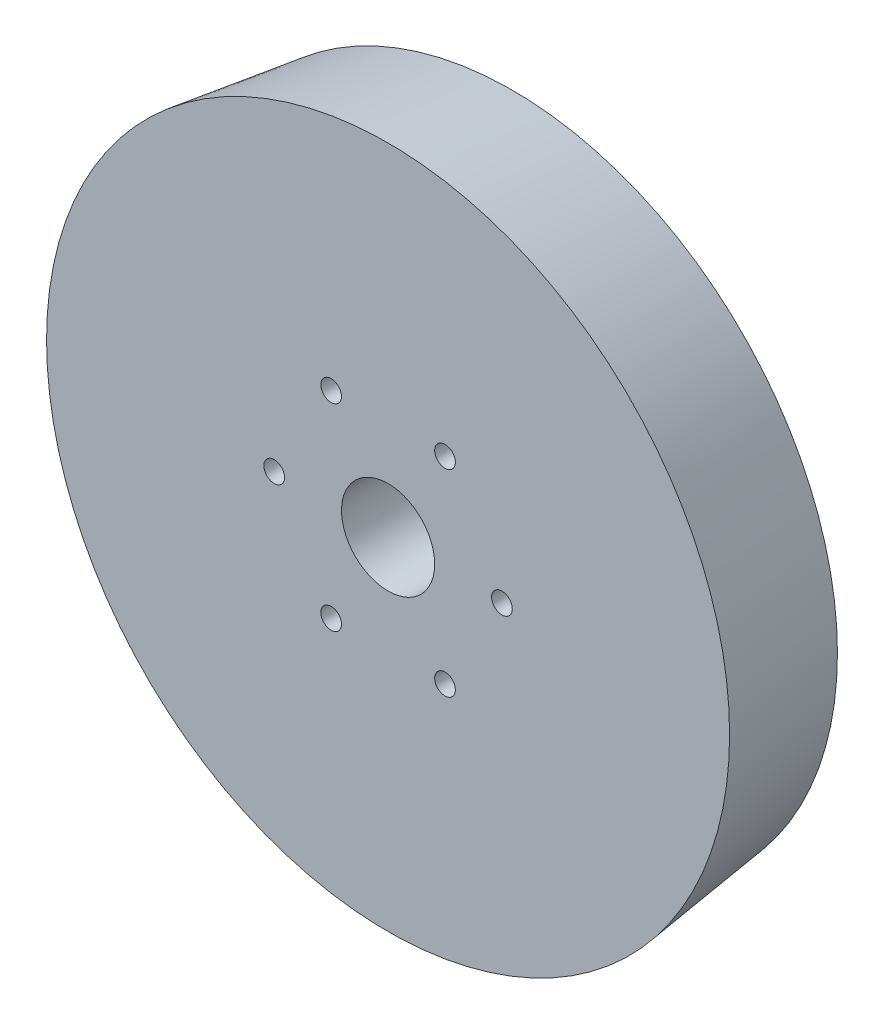
ISO-10303-21;
HEADER;
FILE_DESCRIPTION(('STEP AP214'),'2;1');
FILE_NAME('part.step','',(''),(''),'','','');
FILE_SCHEMA(('AUTOMOTIVE_DESIGN { 1 0 10303 214 1 1 1 1 }'));
ENDSEC;
DATA;
#1=APPLICATION_CONTEXT('core data for automotive mechanical design processes');
#2=APPLICATION_PROTOCOL_DEFINITION('international standard','automotive_design',2000,#1);
#3=PRODUCT_CONTEXT('',#1,'mechanical');
#4=PRODUCT('Part','Part','',(#3));
#5=PRODUCT_RELATED_PRODUCT_CATEGORY('part','',(#4));
#6=PRODUCT_DEFINITION_FORMATION('','',#4);
#7=PRODUCT_DEFINITION_CONTEXT('part definition',#1,'design');
#8=PRODUCT_DEFINITION('design','',#6,#7);
#9=PRODUCT_DEFINITION_SHAPE('','',#8);
#10=(LENGTH_UNIT() NAMED_UNIT(*) SI_UNIT(.MILLI.,.METRE.));
#11=(NAMED_UNIT(*) PLANE_ANGLE_UNIT() SI_UNIT($,.RADIAN.));
#12=(NAMED_UNIT(*) SI_UNIT($,.STERADIAN.) SOLID_ANGLE_UNIT());
#13=UNCERTAINTY_MEASURE_WITH_UNIT(LENGTH_MEASURE(1.E-05),#10,'distance_accuracy_value','');
#14=(GEOMETRIC_REPRESENTATION_CONTEXT(3) GLOBAL_UNCERTAINTY_ASSIGNED_CONTEXT((#13)) GLOBAL_UNIT_ASSIGNED_CONTEXT((#10,
#11,#12)) REPRESENTATION_CONTEXT('',''));
#15=CARTESIAN_POINT('',(0.,0.,0.));
#16=DIRECTION('',(0.,0.,1.));
#17=DIRECTION('',(1.,0.,0.));
#18=AXIS2_PLACEMENT_3D('',#15,#16,#17);
#19=CARTESIAN_POINT('',(0.,0.,0.));
#20=DIRECTION('',(0.,0.,1.));
#21=DIRECTION('',(1.,0.,0.));
#22=AXIS2_PLACEMENT_3D('',#19,#20,#21);
#23=CONICAL_SURFACE('',#22,104.775,0.130899693899575);
#24=CARTESIAN_POINT('',(0.,0.,-38.1));
#25=DIRECTION('',(0.,0.,1.));
#26=DIRECTION('',(1.,0.,0.));
#27=AXIS2_PLACEMENT_3D('',#24,#25,#26);
#28=CIRCLE('',#27,99.7590398419202);
#29=CARTESIAN_POINT('',(99.7590398419202,0.,-38.1));
#30=VERTEX_POINT('',#29);
#31=EDGE_CURVE('E10',#30,#30,#28,.T.);
#32=ORIENTED_EDGE('',*,*,#31,.T.);
#33=EDGE_LOOP('',(#32));
#34=FACE_BOUND('',#33,.T.);
#35=CARTESIAN_POINT('',(0.,0.,0.));
#36=DIRECTION('',(0.,0.,1.));
#37=DIRECTION('',(1.,0.,0.));
#38=AXIS2_PLACEMENT_3D('',#35,#36,#37);
#39=CIRCLE('',#38,104.775);
#40=CARTESIAN_POINT('',(104.775,0.,0.));
#41=VERTEX_POINT('',#40);
#42=EDGE_CURVE('E39',#41,#41,#39,.T.);
#43=ORIENTED_EDGE('',*,*,#42,.F.);
#44=EDGE_LOOP('',(#43));
#45=FACE_BOUND('',#44,.T.);
#46=ADVANCED_FACE('F32',(#34,#45),#23,.T.);
#47=CARTESIAN_POINT('',(0.,0.,-38.1));
#48=DIRECTION('',(0.,0.,1.));
#49=DIRECTION('',(1.,0.,0.));
#50=AXIS2_PLACEMENT_3D('',#47,#48,#49);
#51=PLANE('',#50);
#52=CARTESIAN_POINT('',(17.4625000000004,30.2459372271713,-38.1));
#53=DIRECTION('',(0.,0.,1.));
#54=DIRECTION('',(1.,0.,0.));
#55=AXIS2_PLACEMENT_3D('',#52,#53,#54);
#56=CIRCLE('',#55,3.175);
#57=CARTESIAN_POINT('',(20.6375000000004,30.2459372271713,-38.1));
#58=VERTEX_POINT('',#57);
#59=EDGE_CURVE('E85',#58,#58,#56,.T.);
#60=ORIENTED_EDGE('',*,*,#59,.T.);
#61=EDGE_LOOP('',(#60));
#62=FACE_BOUND('',#61,.T.);
#63=CARTESIAN_POINT('',(-17.4624999999997,30.2459372271717,-38.1));
#64=DIRECTION('',(0.,0.,1.));
#65=DIRECTION('',(1.,0.,0.));
#66=AXIS2_PLACEMENT_3D('',#63,#64,#65);
#67=CIRCLE('',#66,3.175);
#68=CARTESIAN_POINT('',(-14.2874999999997,30.2459372271717,-38.1));
#69=VERTEX_POINT('',#68);
#70=EDGE_CURVE('E79',#69,#69,#67,.T.);
#71=ORIENTED_EDGE('',*,*,#70,.T.);
#72=EDGE_LOOP('',(#71));
#73=FACE_BOUND('',#72,.T.);
#74=CARTESIAN_POINT('',(-34.925,2.43879971518193E-13,-38.1));
#75=DIRECTION('',(0.,0.,1.));
#76=DIRECTION('',(1.,0.,0.));
#77=AXIS2_PLACEMENT_3D('',#74,#75,#76);
#78=CIRCLE('',#77,3.175);
#79=CARTESIAN_POINT('',(-31.75,2.43879971518193E-13,-38.1));
#80=VERTEX_POINT('',#79);
#81=EDGE_CURVE('E73',#80,#80,#78,.T.);
#82=ORIENTED_EDGE('',*,*,#81,.T.);
#83=EDGE_LOOP('',(#82));
#84=FACE_BOUND('',#83,.T.);
#85=CARTESIAN_POINT('',(-17.4625000000001,-30.2459372271714,-38.1));
#86=DIRECTION('',(0.,0.,1.));
#87=DIRECTION('',(1.,0.,0.));
#88=AXIS2_PLACEMENT_3D('',#85,#86,#87);
#89=CIRCLE('',#88,3.175);
#90=CARTESIAN_POINT('',(-14.2875000000001,-30.2459372271714,-38.1));
#91=VERTEX_POINT('',#90);
#92=EDGE_CURVE('E67',#91,#91,#89,.T.);
#93=ORIENTED_EDGE('',*,*,#92,.T.);
#94=EDGE_LOOP('',(#93));
#95=FACE_BOUND('',#94,.T.);
#96=CARTESIAN_POINT('',(17.4624999999999,-30.2459372271716,-38.1));
#97=DIRECTION('',(0.,0.,1.));
#98=DIRECTION('',(1.,0.,0.));
#99=AXIS2_PLACEMENT_3D('',#96,#97,#98);
#100=CIRCLE('',#99,3.17499999999999);
#101=CARTESIAN_POINT('',(20.6374999999999,-30.2459372271716,-38.1));
#102=VERTEX_POINT('',#101);
#103=EDGE_CURVE('E61',#102,#102,#100,.T.);
#104=ORIENTED_EDGE('',*,*,#103,.T.);
#105=EDGE_LOOP('',(#104));
#106=FACE_BOUND('',#105,.T.);
#107=CARTESIAN_POINT('',(34.925,0.,-38.1));
#108=DIRECTION('',(0.,0.,1.));
#109=DIRECTION('',(1.,0.,0.));
#110=AXIS2_PLACEMENT_3D('',#107,#108,#109);
#111=CIRCLE('',#110,3.175);
#112=CARTESIAN_POINT('',(38.1,0.,-38.1));
#113=VERTEX_POINT('',#112);
#114=EDGE_CURVE('E55',#113,#113,#111,.T.);
#115=ORIENTED_EDGE('',*,*,#114,.T.);
#116=EDGE_LOOP('',(#115));
#117=FACE_BOUND('',#116,.T.);
#118=CARTESIAN_POINT('',(0.,0.,-38.1));
#119=DIRECTION('',(0.,0.,1.));
#120=DIRECTION('',(1.,0.,0.));
#121=AXIS2_PLACEMENT_3D('',#118,#119,#120);
#122=CIRCLE('',#121,14.2875);
#123=CARTESIAN_POINT('',(14.2875,0.,-38.1));
#124=VERTEX_POINT('',#123);
#125=EDGE_CURVE('E46',#124,#124,#122,.T.);
#126=ORIENTED_EDGE('',*,*,#125,.T.);
#127=EDGE_LOOP('',(#126));
#128=FACE_BOUND('',#127,.T.);
#129=ORIENTED_EDGE('',*,*,#31,.F.);
#130=EDGE_LOOP('',(#129));
#131=FACE_BOUND('',#130,.T.);
#132=ADVANCED_FACE('F98',(#62,#73,#84,#95,#106,#117,#128,#131),#51,.F.);
#133=CARTESIAN_POINT('',(0.,0.,0.));
#134=DIRECTION('',(0.,0.,1.));
#135=DIRECTION('',(1.,0.,0.));
#136=AXIS2_PLACEMENT_3D('',#133,#134,#135);
#137=PLANE('',#136);
#138=CARTESIAN_POINT('',(17.4625000000004,30.2459372271713,0.));
#139=DIRECTION('',(0.,0.,1.));
#140=DIRECTION('',(1.,0.,0.));
#141=AXIS2_PLACEMENT_3D('',#138,#139,#140);
#142=CIRCLE('',#141,3.175);
#143=CARTESIAN_POINT('',(20.6375000000004,30.2459372271713,0.));
#144=VERTEX_POINT('',#143);
#145=EDGE_CURVE('E88',#144,#144,#142,.T.);
#146=ORIENTED_EDGE('',*,*,#145,.F.);
#147=EDGE_LOOP('',(#146));
#148=FACE_BOUND('',#147,.T.);
#149=CARTESIAN_POINT('',(-17.4624999999997,30.2459372271717,0.));
#150=DIRECTION('',(0.,0.,1.));
#151=DIRECTION('',(1.,0.,0.));
#152=AXIS2_PLACEMENT_3D('',#149,#150,#151);
#153=CIRCLE('',#152,3.175);
#154=CARTESIAN_POINT('',(-14.2874999999997,30.2459372271717,0.));
#155=VERTEX_POINT('',#154);
#156=EDGE_CURVE('E82',#155,#155,#153,.T.);
#157=ORIENTED_EDGE('',*,*,#156,.F.);
#158=EDGE_LOOP('',(#157));
#159=FACE_BOUND('',#158,.T.);
#160=CARTESIAN_POINT('',(-34.925,2.43879971518193E-13,0.));
#161=DIRECTION('',(0.,0.,1.));
#162=DIRECTION('',(1.,0.,0.));
#163=AXIS2_PLACEMENT_3D('',#160,#161,#162);
#164=CIRCLE('',#163,3.175);
#165=CARTESIAN_POINT('',(-31.75,2.43879971518193E-13,0.));
#166=VERTEX_POINT('',#165);
#167=EDGE_CURVE('E76',#166,#166,#164,.T.);
#168=ORIENTED_EDGE('',*,*,#167,.F.);
#169=EDGE_LOOP('',(#168));
#170=FACE_BOUND('',#169,.T.);
#171=CARTESIAN_POINT('',(-17.4625000000001,-30.2459372271714,0.));
#172=DIRECTION('',(0.,0.,1.));
#173=DIRECTION('',(1.,0.,0.));
#174=AXIS2_PLACEMENT_3D('',#171,#172,#173);
#175=CIRCLE('',#174,3.175);
#176=CARTESIAN_POINT('',(-14.2875000000001,-30.2459372271714,0.));
#177=VERTEX_POINT('',#176);
#178=EDGE_CURVE('E70',#177,#177,#175,.T.);
#179=ORIENTED_EDGE('',*,*,#178,.F.);
#180=EDGE_LOOP('',(#179));
#181=FACE_BOUND('',#180,.T.);
#182=CARTESIAN_POINT('',(17.4624999999999,-30.2459372271716,0.));
#183=DIRECTION('',(0.,0.,1.));
#184=DIRECTION('',(1.,0.,0.));
#185=AXIS2_PLACEMENT_3D('',#182,#183,#184);
#186=CIRCLE('',#185,3.17499999999999);
#187=CARTESIAN_POINT('',(20.6374999999999,-30.2459372271716,0.));
#188=VERTEX_POINT('',#187);
#189=EDGE_CURVE('E64',#188,#188,#186,.T.);
#190=ORIENTED_EDGE('',*,*,#189,.F.);
#191=EDGE_LOOP('',(#190));
#192=FACE_BOUND('',#191,.T.);
#193=CARTESIAN_POINT('',(34.925,0.,0.));
#194=DIRECTION('',(0.,0.,1.));
#195=DIRECTION('',(1.,0.,0.));
#196=AXIS2_PLACEMENT_3D('',#193,#194,#195);
#197=CIRCLE('',#196,3.175);
#198=CARTESIAN_POINT('',(38.1,0.,0.));
#199=VERTEX_POINT('',#198);
#200=EDGE_CURVE('E57',#199,#199,#197,.T.);
#201=ORIENTED_EDGE('',*,*,#200,.F.);
#202=EDGE_LOOP('',(#201));
#203=FACE_BOUND('',#202,.T.);
#204=CARTESIAN_POINT('',(0.,0.,0.));
#205=DIRECTION('',(0.,0.,1.));
#206=DIRECTION('',(1.,0.,0.));
#207=AXIS2_PLACEMENT_3D('',#204,#205,#206);
#208=CIRCLE('',#207,14.2875);
#209=CARTESIAN_POINT('',(14.2875,0.,0.));
#210=VERTEX_POINT('',#209);
#211=EDGE_CURVE('E51',#210,#210,#208,.T.);
#212=ORIENTED_EDGE('',*,*,#211,.F.);
#213=EDGE_LOOP('',(#212));
#214=FACE_BOUND('',#213,.T.);
#215=ORIENTED_EDGE('',*,*,#42,.T.);
#216=EDGE_LOOP('',(#215));
#217=FACE_BOUND('',#216,.T.);
#218=ADVANCED_FACE('F108',(#148,#159,#170,#181,#192,#203,#214,#217),#137,.T.);
#219=CARTESIAN_POINT('',(0.,0.,-38.1));
#220=DIRECTION('',(0.,0.,1.));
#221=DIRECTION('',(1.,0.,0.));
#222=AXIS2_PLACEMENT_3D('',#219,#220,#221);
#223=CYLINDRICAL_SURFACE('',#222,14.2875);
#224=CARTESIAN_POINT('',(14.2875,0.,-38.1));
#225=CARTESIAN_POINT('',(14.2875,0.,-37.703125));
#226=CARTESIAN_POINT('',(14.2875,0.,-37.30625));
#227=CARTESIAN_POINT('',(14.2875,0.,-36.5125));
#228=CARTESIAN_POINT('',(14.2875,0.,-36.115625));
#229=CARTESIAN_POINT('',(14.2875,0.,-35.321875));
#230=CARTESIAN_POINT('',(14.2875,0.,-34.925));
#231=CARTESIAN_POINT('',(14.2875,0.,-34.13125));
#232=CARTESIAN_POINT('',(14.2875,0.,-33.734375));
#233=CARTESIAN_POINT('',(14.2875,0.,-32.940625));
#234=CARTESIAN_POINT('',(14.2875,0.,-32.54375));
#235=CARTESIAN_POINT('',(14.2875,0.,-31.75));
#236=CARTESIAN_POINT('',(14.2875,0.,-31.353125));
#237=CARTESIAN_POINT('',(14.2875,0.,-30.559375));
#238=CARTESIAN_POINT('',(14.2875,0.,-30.1625));
#239=CARTESIAN_POINT('',(14.2875,0.,-29.36875));
#240=CARTESIAN_POINT('',(14.2875,0.,-28.971875));
#241=CARTESIAN_POINT('',(14.2875,0.,-28.178125));
#242=CARTESIAN_POINT('',(14.2875,0.,-27.78125));
#243=CARTESIAN_POINT('',(14.2875,0.,-26.9875));
#244=CARTESIAN_POINT('',(14.2875,0.,-26.590625));
#245=CARTESIAN_POINT('',(14.2875,0.,-25.796875));
#246=CARTESIAN_POINT('',(14.2875,0.,-25.4));
#247=CARTESIAN_POINT('',(14.2875,0.,-24.60625));
#248=CARTESIAN_POINT('',(14.2875,0.,-24.209375));
#249=CARTESIAN_POINT('',(14.2875,0.,-23.415625));
#250=CARTESIAN_POINT('',(14.2875,0.,-23.01875));
#251=CARTESIAN_POINT('',(14.2875,0.,-22.225));
#252=CARTESIAN_POINT('',(14.2875,0.,-21.828125));
#253=CARTESIAN_POINT('',(14.2875,0.,-21.034375));
#254=CARTESIAN_POINT('',(14.2875,0.,-20.6375));
#255=CARTESIAN_POINT('',(14.2875,0.,-19.84375));
#256=CARTESIAN_POINT('',(14.2875,0.,-19.446875));
#257=CARTESIAN_POINT('',(14.2875,0.,-18.653125));
#258=CARTESIAN_POINT('',(14.2875,0.,-18.25625));
#259=CARTESIAN_POINT('',(14.2875,0.,-17.4625));
#260=CARTESIAN_POINT('',(14.2875,0.,-17.065625));
#261=CARTESIAN_POINT('',(14.2875,0.,-16.271875));
#262=CARTESIAN_POINT('',(14.2875,0.,-15.875));
#263=CARTESIAN_POINT('',(14.2875,0.,-15.08125));
#264=CARTESIAN_POINT('',(14.2875,0.,-14.684375));
#265=CARTESIAN_POINT('',(14.2875,0.,-13.890625));
#266=CARTESIAN_POINT('',(14.2875,0.,-13.49375));
#267=CARTESIAN_POINT('',(14.2875,0.,-12.7));
#268=CARTESIAN_POINT('',(14.2875,0.,-12.303125));
#269=CARTESIAN_POINT('',(14.2875,0.,-11.509375));
#270=CARTESIAN_POINT('',(14.2875,0.,-11.1125));
#271=CARTESIAN_POINT('',(14.2875,0.,-10.31875));
#272=CARTESIAN_POINT('',(14.2875,0.,-9.921875));
#273=CARTESIAN_POINT('',(14.2875,0.,-9.128125));
#274=CARTESIAN_POINT('',(14.2875,0.,-8.73125));
#275=CARTESIAN_POINT('',(14.2875,0.,-7.9375));
#276=CARTESIAN_POINT('',(14.2875,0.,-7.540625));
#277=CARTESIAN_POINT('',(14.2875,0.,-6.746875));
#278=CARTESIAN_POINT('',(14.2875,0.,-6.35));
#279=CARTESIAN_POINT('',(14.2875,0.,-5.55625));
#280=CARTESIAN_POINT('',(14.2875,0.,-5.159375));
#281=CARTESIAN_POINT('',(14.2875,0.,-4.365625));
#282=CARTESIAN_POINT('',(14.2875,0.,-3.96875));
#283=CARTESIAN_POINT('',(14.2875,0.,-3.175));
#284=CARTESIAN_POINT('',(14.2875,0.,-2.778125));
#285=CARTESIAN_POINT('',(14.2875,0.,-1.984375));
#286=CARTESIAN_POINT('',(14.2875,0.,-1.5875));
#287=CARTESIAN_POINT('',(14.2875,0.,-0.79375));
#288=CARTESIAN_POINT('',(14.2875,0.,-0.396875));
#289=CARTESIAN_POINT('',(14.2875,0.,0.));
#290=B_SPLINE_CURVE_WITH_KNOTS('',3,(#224,#225,#226,#227,#228,#229,#230,#231,#232,#233,#234,
#235,#236,#237,#238,#239,#240,#241,#242,#243,#244,#245,#246,#247,#248,#249,#250,#251,#252,#253,
#254,#255,#256,#257,#258,#259,#260,#261,#262,#263,#264,#265,#266,#267,#268,#269,#270,#271,#272,
#273,#274,#275,#276,#277,#278,#279,#280,#281,#282,#283,#284,#285,#286,#287,#288,#289),
.UNSPECIFIED.,.F.,.F.,(4,2,2,2,2,2,2,2,2,2,2,2,2,2,2,2,2,2,2,2,2,2,2,2,2,2,2,2,2,2,2,2,4),(0.,
1.190625,2.38125,3.571875,4.7625,5.953125,7.14375,8.334375,9.52500000000001,10.715625,11.90625,
13.096875,14.2875,15.478125,16.66875,17.859375,19.05,20.240625,21.43125,22.621875,23.8125,
25.003125,26.19375,27.384375,28.575,29.765625,30.95625,32.146875,33.3375,34.528125,35.71875,
36.909375,38.1),.UNSPECIFIED.);
#291=EDGE_CURVE('BSEAM111',#124,#210,#290,.T.);
#292=ORIENTED_EDGE('',*,*,#125,.F.);
#293=ORIENTED_EDGE('',*,*,#211,.T.);
#294=ORIENTED_EDGE('',*,*,#291,.T.);
#295=ORIENTED_EDGE('',*,*,#291,.F.);
#296=EDGE_LOOP('',(#292,#294,#293,#295));
#297=FACE_BOUND('',#296,.T.);
#298=ADVANCED_FACE('F111',(#297),#223,.F.);
#299=CARTESIAN_POINT('',(34.925,0.,-38.1));
#300=DIRECTION('',(0.,0.,1.));
#301=DIRECTION('',(1.,0.,0.));
#302=AXIS2_PLACEMENT_3D('',#299,#300,#301);
#303=CYLINDRICAL_SURFACE('',#302,3.175);
#304=CARTESIAN_POINT('',(38.1,0.,-38.1));
#305=CARTESIAN_POINT('',(38.1,0.,-37.703125));
#306=CARTESIAN_POINT('',(38.1,0.,-37.30625));
#307=CARTESIAN_POINT('',(38.1,0.,-36.5125));
#308=CARTESIAN_POINT('',(38.1,0.,-36.115625));
#309=CARTESIAN_POINT('',(38.1,0.,-35.321875));
#310=CARTESIAN_POINT('',(38.1,0.,-34.925));
#311=CARTESIAN_POINT('',(38.1,0.,-34.13125));
#312=CARTESIAN_POINT('',(38.1,0.,-33.734375));
#313=CARTESIAN_POINT('',(38.1,0.,-32.940625));
#314=CARTESIAN_POINT('',(38.1,0.,-32.54375));
#315=CARTESIAN_POINT('',(38.1,0.,-31.75));
#316=CARTESIAN_POINT('',(38.1,0.,-31.353125));
#317=CARTESIAN_POINT('',(38.1,0.,-30.559375));
#318=CARTESIAN_POINT('',(38.1,0.,-30.1625));
#319=CARTESIAN_POINT('',(38.1,0.,-29.36875));
#320=CARTESIAN_POINT('',(38.1,0.,-28.971875));
#321=CARTESIAN_POINT('',(38.1,0.,-28.178125));
#322=CARTESIAN_POINT('',(38.1,0.,-27.78125));
#323=CARTESIAN_POINT('',(38.1,0.,-26.9875));
#324=CARTESIAN_POINT('',(38.1,0.,-26.590625));
#325=CARTESIAN_POINT('',(38.1,0.,-25.796875));
#326=CARTESIAN_POINT('',(38.1,0.,-25.4));
#327=CARTESIAN_POINT('',(38.1,0.,-24.60625));
#328=CARTESIAN_POINT('',(38.1,0.,-24.209375));
#329=CARTESIAN_POINT('',(38.1,0.,-23.415625));
#330=CARTESIAN_POINT('',(38.1,0.,-23.01875));
#331=CARTESIAN_POINT('',(38.1,0.,-22.225));
#332=CARTESIAN_POINT('',(38.1,0.,-21.828125));
#333=CARTESIAN_POINT('',(38.1,0.,-21.034375));
#334=CARTESIAN_POINT('',(38.1,0.,-20.6375));
#335=CARTESIAN_POINT('',(38.1,0.,-19.84375));
#336=CARTESIAN_POINT('',(38.1,0.,-19.446875));
#337=CARTESIAN_POINT('',(38.1,0.,-18.653125));
#338=CARTESIAN_POINT('',(38.1,0.,-18.25625));
#339=CARTESIAN_POINT('',(38.1,0.,-17.4625));
#340=CARTESIAN_POINT('',(38.1,0.,-17.065625));
#341=CARTESIAN_POINT('',(38.1,0.,-16.271875));
#342=CARTESIAN_POINT('',(38.1,0.,-15.875));
#343=CARTESIAN_POINT('',(38.1,0.,-15.08125));
#344=CARTESIAN_POINT('',(38.1,0.,-14.684375));
#345=CARTESIAN_POINT('',(38.1,0.,-13.890625));
#346=CARTESIAN_POINT('',(38.1,0.,-13.49375));
#347=CARTESIAN_POINT('',(38.1,0.,-12.7));
#348=CARTESIAN_POINT('',(38.1,0.,-12.303125));
#349=CARTESIAN_POINT('',(38.1,0.,-11.509375));
#350=CARTESIAN_POINT('',(38.1,0.,-11.1125));
#351=CARTESIAN_POINT('',(38.1,0.,-10.31875));
#352=CARTESIAN_POINT('',(38.1,0.,-9.921875));
#353=CARTESIAN_POINT('',(38.1,0.,-9.128125));
#354=CARTESIAN_POINT('',(38.1,0.,-8.73125));
#355=CARTESIAN_POINT('',(38.1,0.,-7.9375));
#356=CARTESIAN_POINT('',(38.1,0.,-7.540625));
#357=CARTESIAN_POINT('',(38.1,0.,-6.746875));
#358=CARTESIAN_POINT('',(38.1,0.,-6.35));
#359=CARTESIAN_POINT('',(38.1,0.,-5.55625));
#360=CARTESIAN_POINT('',(38.1,0.,-5.159375));
#361=CARTESIAN_POINT('',(38.1,0.,-4.365625));
#362=CARTESIAN_POINT('',(38.1,0.,-3.96875));
#363=CARTESIAN_POINT('',(38.1,0.,-3.175));
#364=CARTESIAN_POINT('',(38.1,0.,-2.778125));
#365=CARTESIAN_POINT('',(38.1,0.,-1.984375));
#366=CARTESIAN_POINT('',(38.1,0.,-1.5875));
#367=CARTESIAN_POINT('',(38.1,0.,-0.79375));
#368=CARTESIAN_POINT('',(38.1,0.,-0.396875));
#369=CARTESIAN_POINT('',(38.1,0.,0.));
#370=B_SPLINE_CURVE_WITH_KNOTS('',3,(#304,#305,#306,#307,#308,#309,#310,#311,#312,#313,#314,
#315,#316,#317,#318,#319,#320,#321,#322,#323,#324,#325,#326,#327,#328,#329,#330,#331,#332,#333,
#334,#335,#336,#337,#338,#339,#340,#341,#342,#343,#344,#345,#346,#347,#348,#349,#350,#351,#352,
#353,#354,#355,#356,#357,#358,#359,#360,#361,#362,#363,#364,#365,#366,#367,#368,#369),
.UNSPECIFIED.,.F.,.F.,(4,2,2,2,2,2,2,2,2,2,2,2,2,2,2,2,2,2,2,2,2,2,2,2,2,2,2,2,2,2,2,2,4),(0.,
1.190625,2.38125,3.571875,4.7625,5.953125,7.14375,8.334375,9.52500000000001,10.715625,11.90625,
13.096875,14.2875,15.478125,16.66875,17.859375,19.05,20.240625,21.43125,22.621875,23.8125,
25.003125,26.19375,27.384375,28.575,29.765625,30.95625,32.146875,33.3375,34.528125,35.71875,
36.909375,38.1),.UNSPECIFIED.);
#371=EDGE_CURVE('BSEAM125',#113,#199,#370,.T.);
#372=ORIENTED_EDGE('',*,*,#114,.F.);
#373=ORIENTED_EDGE('',*,*,#200,.T.);
#374=ORIENTED_EDGE('',*,*,#371,.T.);
#375=ORIENTED_EDGE('',*,*,#371,.F.);
#376=EDGE_LOOP('',(#372,#374,#373,#375));
#377=FACE_BOUND('',#376,.T.);
#378=ADVANCED_FACE('F125',(#377),#303,.F.);
#379=CARTESIAN_POINT('',(17.4624999999999,-30.2459372271716,-38.1));
#380=DIRECTION('',(0.,0.,1.));
#381=DIRECTION('',(1.,0.,0.));
#382=AXIS2_PLACEMENT_3D('',#379,#380,#381);
#383=CYLINDRICAL_SURFACE('',#382,3.17499999999999);
#384=CARTESIAN_POINT('',(20.6374999999999,-30.2459372271716,-38.1));
#385=CARTESIAN_POINT('',(20.6374999999999,-30.2459372271716,-37.703125));
#386=CARTESIAN_POINT('',(20.6374999999999,-30.2459372271716,-37.30625));
#387=CARTESIAN_POINT('',(20.6374999999999,-30.2459372271716,-36.5125));
#388=CARTESIAN_POINT('',(20.6374999999999,-30.2459372271716,-36.115625));
#389=CARTESIAN_POINT('',(20.6374999999999,-30.2459372271716,-35.321875));
#390=CARTESIAN_POINT('',(20.6374999999999,-30.2459372271716,-34.925));
#391=CARTESIAN_POINT('',(20.6374999999999,-30.2459372271716,-34.13125));
#392=CARTESIAN_POINT('',(20.6374999999999,-30.2459372271716,-33.734375));
#393=CARTESIAN_POINT('',(20.6374999999999,-30.2459372271716,-32.940625));
#394=CARTESIAN_POINT('',(20.6374999999999,-30.2459372271716,-32.54375));
#395=CARTESIAN_POINT('',(20.6374999999999,-30.2459372271716,-31.75));
#396=CARTESIAN_POINT('',(20.6374999999999,-30.2459372271716,-31.353125));
#397=CARTESIAN_POINT('',(20.6374999999999,-30.2459372271716,-30.559375));
#398=CARTESIAN_POINT('',(20.6374999999999,-30.2459372271716,-30.1625));
#399=CARTESIAN_POINT('',(20.6374999999999,-30.2459372271716,-29.36875));
#400=CARTESIAN_POINT('',(20.6374999999999,-30.2459372271716,-28.971875));
#401=CARTESIAN_POINT('',(20.6374999999999,-30.2459372271716,-28.178125));
#402=CARTESIAN_POINT('',(20.6374999999999,-30.2459372271716,-27.78125));
#403=CARTESIAN_POINT('',(20.6374999999999,-30.2459372271716,-26.9875));
#404=CARTESIAN_POINT('',(20.6374999999999,-30.2459372271716,-26.590625));
#405=CARTESIAN_POINT('',(20.6374999999999,-30.2459372271716,-25.796875));
#406=CARTESIAN_POINT('',(20.6374999999999,-30.2459372271716,-25.4));
#407=CARTESIAN_POINT('',(20.6374999999999,-30.2459372271716,-24.60625));
#408=CARTESIAN_POINT('',(20.6374999999999,-30.2459372271716,-24.209375));
#409=CARTESIAN_POINT('',(20.6374999999999,-30.2459372271716,-23.415625));
#410=CARTESIAN_POINT('',(20.6374999999999,-30.2459372271716,-23.01875));
#411=CARTESIAN_POINT('',(20.6374999999999,-30.2459372271716,-22.225));
#412=CARTESIAN_POINT('',(20.6374999999999,-30.2459372271716,-21.828125));
#413=CARTESIAN_POINT('',(20.6374999999999,-30.2459372271716,-21.034375));
#414=CARTESIAN_POINT('',(20.6374999999999,-30.2459372271716,-20.6375));
#415=CARTESIAN_POINT('',(20.6374999999999,-30.2459372271716,-19.84375));
#416=CARTESIAN_POINT('',(20.6374999999999,-30.2459372271716,-19.446875));
#417=CARTESIAN_POINT('',(20.6374999999999,-30.2459372271716,-18.653125));
#418=CARTESIAN_POINT('',(20.6374999999999,-30.2459372271716,-18.25625));
#419=CARTESIAN_POINT('',(20.6374999999999,-30.2459372271716,-17.4625));
#420=CARTESIAN_POINT('',(20.6374999999999,-30.2459372271716,-17.065625));
#421=CARTESIAN_POINT('',(20.6374999999999,-30.2459372271716,-16.271875));
#422=CARTESIAN_POINT('',(20.6374999999999,-30.2459372271716,-15.875));
#423=CARTESIAN_POINT('',(20.6374999999999,-30.2459372271716,-15.08125));
#424=CARTESIAN_POINT('',(20.6374999999999,-30.2459372271716,-14.684375));
#425=CARTESIAN_POINT('',(20.6374999999999,-30.2459372271716,-13.890625));
#426=CARTESIAN_POINT('',(20.6374999999999,-30.2459372271716,-13.49375));
#427=CARTESIAN_POINT('',(20.6374999999999,-30.2459372271716,-12.7));
#428=CARTESIAN_POINT('',(20.6374999999999,-30.2459372271716,-12.303125));
#429=CARTESIAN_POINT('',(20.6374999999999,-30.2459372271716,-11.509375));
#430=CARTESIAN_POINT('',(20.6374999999999,-30.2459372271716,-11.1125));
#431=CARTESIAN_POINT('',(20.6374999999999,-30.2459372271716,-10.31875));
#432=CARTESIAN_POINT('',(20.6374999999999,-30.2459372271716,-9.921875));
#433=CARTESIAN_POINT('',(20.6374999999999,-30.2459372271716,-9.128125));
#434=CARTESIAN_POINT('',(20.6374999999999,-30.2459372271716,-8.73125));
#435=CARTESIAN_POINT('',(20.6374999999999,-30.2459372271716,-7.9375));
#436=CARTESIAN_POINT('',(20.6374999999999,-30.2459372271716,-7.540625));
#437=CARTESIAN_POINT('',(20.6374999999999,-30.2459372271716,-6.746875));
#438=CARTESIAN_POINT('',(20.6374999999999,-30.2459372271716,-6.35));
#439=CARTESIAN_POINT('',(20.6374999999999,-30.2459372271716,-5.55625));
#440=CARTESIAN_POINT('',(20.6374999999999,-30.2459372271716,-5.159375));
#441=CARTESIAN_POINT('',(20.6374999999999,-30.2459372271716,-4.365625));
#442=CARTESIAN_POINT('',(20.6374999999999,-30.2459372271716,-3.96875));
#443=CARTESIAN_POINT('',(20.6374999999999,-30.2459372271716,-3.175));
#444=CARTESIAN_POINT('',(20.6374999999999,-30.2459372271716,-2.778125));
#445=CARTESIAN_POINT('',(20.6374999999999,-30.2459372271716,-1.984375));
#446=CARTESIAN_POINT('',(20.6374999999999,-30.2459372271716,-1.5875));
#447=CARTESIAN_POINT('',(20.6374999999999,-30.2459372271716,-0.79375));
#448=CARTESIAN_POINT('',(20.6374999999999,-30.2459372271716,-0.396875));
#449=CARTESIAN_POINT('',(20.6374999999999,-30.2459372271716,0.));
#450=B_SPLINE_CURVE_WITH_KNOTS('',3,(#384,#385,#386,#387,#388,#389,#390,#391,#392,#393,#394,
#395,#396,#397,#398,#399,#400,#401,#402,#403,#404,#405,#406,#407,#408,#409,#410,#411,#412,#413,
#414,#415,#416,#417,#418,#419,#420,#421,#422,#423,#424,#425,#426,#427,#428,#429,#430,#431,#432,
#433,#434,#435,#436,#437,#438,#439,#440,#441,#442,#443,#444,#445,#446,#447,#448,#449),
.UNSPECIFIED.,.F.,.F.,(4,2,2,2,2,2,2,2,2,2,2,2,2,2,2,2,2,2,2,2,2,2,2,2,2,2,2,2,2,2,2,2,4),(0.,
1.190625,2.38125,3.571875,4.7625,5.953125,7.14375,8.334375,9.52500000000001,10.715625,11.90625,
13.096875,14.2875,15.478125,16.66875,17.859375,19.05,20.240625,21.43125,22.621875,23.8125,
25.003125,26.19375,27.384375,28.575,29.765625,30.95625,32.146875,33.3375,34.528125,35.71875,
36.909375,38.1),.UNSPECIFIED.);
#451=EDGE_CURVE('BSEAM130',#102,#188,#450,.T.);
#452=ORIENTED_EDGE('',*,*,#103,.F.);
#453=ORIENTED_EDGE('',*,*,#189,.T.);
#454=ORIENTED_EDGE('',*,*,#451,.T.);
#455=ORIENTED_EDGE('',*,*,#451,.F.);
#456=EDGE_LOOP('',(#452,#454,#453,#455));
#457=FACE_BOUND('',#456,.T.);
#458=ADVANCED_FACE('F130',(#457),#383,.F.);
#459=CARTESIAN_POINT('',(-17.4625000000001,-30.2459372271714,-38.1));
#460=DIRECTION('',(0.,0.,1.));
#461=DIRECTION('',(1.,0.,0.));
#462=AXIS2_PLACEMENT_3D('',#459,#460,#461);
#463=CYLINDRICAL_SURFACE('',#462,3.175);
#464=CARTESIAN_POINT('',(-14.2875000000001,-30.2459372271714,-38.1));
#465=CARTESIAN_POINT('',(-14.2875000000001,-30.2459372271714,-37.703125));
#466=CARTESIAN_POINT('',(-14.2875000000001,-30.2459372271714,-37.30625));
#467=CARTESIAN_POINT('',(-14.2875000000001,-30.2459372271714,-36.5125));
#468=CARTESIAN_POINT('',(-14.2875000000001,-30.2459372271714,-36.115625));
#469=CARTESIAN_POINT('',(-14.2875000000001,-30.2459372271714,-35.321875));
#470=CARTESIAN_POINT('',(-14.2875000000001,-30.2459372271714,-34.925));
#471=CARTESIAN_POINT('',(-14.2875000000001,-30.2459372271714,-34.13125));
#472=CARTESIAN_POINT('',(-14.2875000000001,-30.2459372271714,-33.734375));
#473=CARTESIAN_POINT('',(-14.2875000000001,-30.2459372271714,-32.940625));
#474=CARTESIAN_POINT('',(-14.2875000000001,-30.2459372271714,-32.54375));
#475=CARTESIAN_POINT('',(-14.2875000000001,-30.2459372271714,-31.75));
#476=CARTESIAN_POINT('',(-14.2875000000001,-30.2459372271714,-31.353125));
#477=CARTESIAN_POINT('',(-14.2875000000001,-30.2459372271714,-30.559375));
#478=CARTESIAN_POINT('',(-14.2875000000001,-30.2459372271714,-30.1625));
#479=CARTESIAN_POINT('',(-14.2875000000001,-30.2459372271714,-29.36875));
#480=CARTESIAN_POINT('',(-14.2875000000001,-30.2459372271714,-28.971875));
#481=CARTESIAN_POINT('',(-14.2875000000001,-30.2459372271714,-28.178125));
#482=CARTESIAN_POINT('',(-14.2875000000001,-30.2459372271714,-27.78125));
#483=CARTESIAN_POINT('',(-14.2875000000001,-30.2459372271714,-26.9875));
#484=CARTESIAN_POINT('',(-14.2875000000001,-30.2459372271714,-26.590625));
#485=CARTESIAN_POINT('',(-14.2875000000001,-30.2459372271714,-25.796875));
#486=CARTESIAN_POINT('',(-14.2875000000001,-30.2459372271714,-25.4));
#487=CARTESIAN_POINT('',(-14.2875000000001,-30.2459372271714,-24.60625));
#488=CARTESIAN_POINT('',(-14.2875000000001,-30.2459372271714,-24.209375));
#489=CARTESIAN_POINT('',(-14.2875000000001,-30.2459372271714,-23.415625));
#490=CARTESIAN_POINT('',(-14.2875000000001,-30.2459372271714,-23.01875));
#491=CARTESIAN_POINT('',(-14.2875000000001,-30.2459372271714,-22.225));
#492=CARTESIAN_POINT('',(-14.2875000000001,-30.2459372271714,-21.828125));
#493=CARTESIAN_POINT('',(-14.2875000000001,-30.2459372271714,-21.034375));
#494=CARTESIAN_POINT('',(-14.2875000000001,-30.2459372271714,-20.6375));
#495=CARTESIAN_POINT('',(-14.2875000000001,-30.2459372271714,-19.84375));
#496=CARTESIAN_POINT('',(-14.2875000000001,-30.2459372271714,-19.446875));
#497=CARTESIAN_POINT('',(-14.2875000000001,-30.2459372271714,-18.653125));
#498=CARTESIAN_POINT('',(-14.2875000000001,-30.2459372271714,-18.25625));
#499=CARTESIAN_POINT('',(-14.2875000000001,-30.2459372271714,-17.4625));
#500=CARTESIAN_POINT('',(-14.2875000000001,-30.2459372271714,-17.065625));
#501=CARTESIAN_POINT('',(-14.2875000000001,-30.2459372271714,-16.271875));
#502=CARTESIAN_POINT('',(-14.2875000000001,-30.2459372271714,-15.875));
#503=CARTESIAN_POINT('',(-14.2875000000001,-30.2459372271714,-15.08125));
#504=CARTESIAN_POINT('',(-14.2875000000001,-30.2459372271714,-14.684375));
#505=CARTESIAN_POINT('',(-14.2875000000001,-30.2459372271714,-13.890625));
#506=CARTESIAN_POINT('',(-14.2875000000001,-30.2459372271714,-13.49375));
#507=CARTESIAN_POINT('',(-14.2875000000001,-30.2459372271714,-12.7));
#508=CARTESIAN_POINT('',(-14.2875000000001,-30.2459372271714,-12.303125));
#509=CARTESIAN_POINT('',(-14.2875000000001,-30.2459372271714,-11.509375));
#510=CARTESIAN_POINT('',(-14.2875000000001,-30.2459372271714,-11.1125));
#511=CARTESIAN_POINT('',(-14.2875000000001,-30.2459372271714,-10.31875));
#512=CARTESIAN_POINT('',(-14.2875000000001,-30.2459372271714,-9.921875));
#513=CARTESIAN_POINT('',(-14.2875000000001,-30.2459372271714,-9.128125));
#514=CARTESIAN_POINT('',(-14.2875000000001,-30.2459372271714,-8.73125));
#515=CARTESIAN_POINT('',(-14.2875000000001,-30.2459372271714,-7.9375));
#516=CARTESIAN_POINT('',(-14.2875000000001,-30.2459372271714,-7.540625));
#517=CARTESIAN_POINT('',(-14.2875000000001,-30.2459372271714,-6.746875));
#518=CARTESIAN_POINT('',(-14.2875000000001,-30.2459372271714,-6.35));
#519=CARTESIAN_POINT('',(-14.2875000000001,-30.2459372271714,-5.55625));
#520=CARTESIAN_POINT('',(-14.2875000000001,-30.2459372271714,-5.159375));
#521=CARTESIAN_POINT('',(-14.2875000000001,-30.2459372271714,-4.365625));
#522=CARTESIAN_POINT('',(-14.2875000000001,-30.2459372271714,-3.96875));
#523=CARTESIAN_POINT('',(-14.2875000000001,-30.2459372271714,-3.175));
#524=CARTESIAN_POINT('',(-14.2875000000001,-30.2459372271714,-2.778125));
#525=CARTESIAN_POINT('',(-14.2875000000001,-30.2459372271714,-1.984375));
#526=CARTESIAN_POINT('',(-14.2875000000001,-30.2459372271714,-1.5875));
#527=CARTESIAN_POINT('',(-14.2875000000001,-30.2459372271714,-0.79375));
#528=CARTESIAN_POINT('',(-14.2875000000001,-30.2459372271714,-0.396875));
#529=CARTESIAN_POINT('',(-14.2875000000001,-30.2459372271714,0.));
#530=B_SPLINE_CURVE_WITH_KNOTS('',3,(#464,#465,#466,#467,#468,#469,#470,#471,#472,#473,#474,
#475,#476,#477,#478,#479,#480,#481,#482,#483,#484,#485,#486,#487,#488,#489,#490,#491,#492,#493,
#494,#495,#496,#497,#498,#499,#500,#501,#502,#503,#504,#505,#506,#507,#508,#509,#510,#511,#512,
#513,#514,#515,#516,#517,#518,#519,#520,#521,#522,#523,#524,#525,#526,#527,#528,#529),
.UNSPECIFIED.,.F.,.F.,(4,2,2,2,2,2,2,2,2,2,2,2,2,2,2,2,2,2,2,2,2,2,2,2,2,2,2,2,2,2,2,2,4),(0.,
1.190625,2.38125,3.571875,4.7625,5.953125,7.14375,8.334375,9.52500000000001,10.715625,11.90625,
13.096875,14.2875,15.478125,16.66875,17.859375,19.05,20.240625,21.43125,22.621875,23.8125,
25.003125,26.19375,27.384375,28.575,29.765625,30.95625,32.146875,33.3375,34.528125,35.71875,
36.909375,38.1),.UNSPECIFIED.);
#531=EDGE_CURVE('BSEAM180',#91,#177,#530,.T.);
#532=ORIENTED_EDGE('',*,*,#92,.F.);
#533=ORIENTED_EDGE('',*,*,#178,.T.);
#534=ORIENTED_EDGE('',*,*,#531,.T.);
#535=ORIENTED_EDGE('',*,*,#531,.F.);
#536=EDGE_LOOP('',(#532,#534,#533,#535));
#537=FACE_BOUND('',#536,.T.);
#538=ADVANCED_FACE('F180',(#537),#463,.F.);
#539=CARTESIAN_POINT('',(-34.925,2.43879971518193E-13,-38.1));
#540=DIRECTION('',(0.,0.,1.));
#541=DIRECTION('',(1.,0.,0.));
#542=AXIS2_PLACEMENT_3D('',#539,#540,#541);
#543=CYLINDRICAL_SURFACE('',#542,3.175);
#544=CARTESIAN_POINT('',(-31.75,2.43879971518193E-13,-38.1));
#545=CARTESIAN_POINT('',(-31.75,2.43879971518193E-13,-37.703125));
#546=CARTESIAN_POINT('',(-31.75,2.43879971518193E-13,-37.30625));
#547=CARTESIAN_POINT('',(-31.75,2.43879971518193E-13,-36.5125));
#548=CARTESIAN_POINT('',(-31.75,2.43879971518193E-13,-36.115625));
#549=CARTESIAN_POINT('',(-31.75,2.43879971518193E-13,-35.321875));
#550=CARTESIAN_POINT('',(-31.75,2.43879971518193E-13,-34.925));
#551=CARTESIAN_POINT('',(-31.75,2.43879971518193E-13,-34.13125));
#552=CARTESIAN_POINT('',(-31.75,2.43879971518193E-13,-33.734375));
#553=CARTESIAN_POINT('',(-31.75,2.43879971518193E-13,-32.940625));
#554=CARTESIAN_POINT('',(-31.75,2.43879971518193E-13,-32.54375));
#555=CARTESIAN_POINT('',(-31.75,2.43879971518193E-13,-31.75));
#556=CARTESIAN_POINT('',(-31.75,2.43879971518193E-13,-31.353125));
#557=CARTESIAN_POINT('',(-31.75,2.43879971518193E-13,-30.559375));
#558=CARTESIAN_POINT('',(-31.75,2.43879971518193E-13,-30.1625));
#559=CARTESIAN_POINT('',(-31.75,2.43879971518193E-13,-29.36875));
#560=CARTESIAN_POINT('',(-31.75,2.43879971518193E-13,-28.971875));
#561=CARTESIAN_POINT('',(-31.75,2.43879971518193E-13,-28.178125));
#562=CARTESIAN_POINT('',(-31.75,2.43879971518193E-13,-27.78125));
#563=CARTESIAN_POINT('',(-31.75,2.43879971518193E-13,-26.9875));
#564=CARTESIAN_POINT('',(-31.75,2.43879971518193E-13,-26.590625));
#565=CARTESIAN_POINT('',(-31.75,2.43879971518193E-13,-25.796875));
#566=CARTESIAN_POINT('',(-31.75,2.43879971518193E-13,-25.4));
#567=CARTESIAN_POINT('',(-31.75,2.43879971518193E-13,-24.60625));
#568=CARTESIAN_POINT('',(-31.75,2.43879971518193E-13,-24.209375));
#569=CARTESIAN_POINT('',(-31.75,2.43879971518193E-13,-23.415625));
#570=CARTESIAN_POINT('',(-31.75,2.43879971518193E-13,-23.01875));
#571=CARTESIAN_POINT('',(-31.75,2.43879971518193E-13,-22.225));
#572=CARTESIAN_POINT('',(-31.75,2.43879971518193E-13,-21.828125));
#573=CARTESIAN_POINT('',(-31.75,2.43879971518193E-13,-21.034375));
#574=CARTESIAN_POINT('',(-31.75,2.43879971518193E-13,-20.6375));
#575=CARTESIAN_POINT('',(-31.75,2.43879971518193E-13,-19.84375));
#576=CARTESIAN_POINT('',(-31.75,2.43879971518193E-13,-19.446875));
#577=CARTESIAN_POINT('',(-31.75,2.43879971518193E-13,-18.653125));
#578=CARTESIAN_POINT('',(-31.75,2.43879971518193E-13,-18.25625));
#579=CARTESIAN_POINT('',(-31.75,2.43879971518193E-13,-17.4625));
#580=CARTESIAN_POINT('',(-31.75,2.43879971518193E-13,-17.065625));
#581=CARTESIAN_POINT('',(-31.75,2.43879971518193E-13,-16.271875));
#582=CARTESIAN_POINT('',(-31.75,2.43879971518193E-13,-15.875));
#583=CARTESIAN_POINT('',(-31.75,2.43879971518193E-13,-15.08125));
#584=CARTESIAN_POINT('',(-31.75,2.43879971518193E-13,-14.684375));
#585=CARTESIAN_POINT('',(-31.75,2.43879971518193E-13,-13.890625));
#586=CARTESIAN_POINT('',(-31.75,2.43879971518193E-13,-13.49375));
#587=CARTESIAN_POINT('',(-31.75,2.43879971518193E-13,-12.7));
#588=CARTESIAN_POINT('',(-31.75,2.43879971518193E-13,-12.303125));
#589=CARTESIAN_POINT('',(-31.75,2.43879971518193E-13,-11.509375));
#590=CARTESIAN_POINT('',(-31.75,2.43879971518193E-13,-11.1125));
#591=CARTESIAN_POINT('',(-31.75,2.43879971518193E-13,-10.31875));
#592=CARTESIAN_POINT('',(-31.75,2.43879971518193E-13,-9.921875));
#593=CARTESIAN_POINT('',(-31.75,2.43879971518193E-13,-9.128125));
#594=CARTESIAN_POINT('',(-31.75,2.43879971518193E-13,-8.73125));
#595=CARTESIAN_POINT('',(-31.75,2.43879971518193E-13,-7.9375));
#596=CARTESIAN_POINT('',(-31.75,2.43879971518193E-13,-7.540625));
#597=CARTESIAN_POINT('',(-31.75,2.43879971518193E-13,-6.746875));
#598=CARTESIAN_POINT('',(-31.75,2.43879971518193E-13,-6.35));
#599=CARTESIAN_POINT('',(-31.75,2.43879971518193E-13,-5.55625));
#600=CARTESIAN_POINT('',(-31.75,2.43879971518193E-13,-5.159375));
#601=CARTESIAN_POINT('',(-31.75,2.43879971518193E-13,-4.365625));
#602=CARTESIAN_POINT('',(-31.75,2.43879971518193E-13,-3.96875));
#603=CARTESIAN_POINT('',(-31.75,2.43879971518193E-13,-3.175));
#604=CARTESIAN_POINT('',(-31.75,2.43879971518193E-13,-2.778125));
#605=CARTESIAN_POINT('',(-31.75,2.43879971518193E-13,-1.984375));
#606=CARTESIAN_POINT('',(-31.75,2.43879971518193E-13,-1.5875));
#607=CARTESIAN_POINT('',(-31.75,2.43879971518193E-13,-0.79375));
#608=CARTESIAN_POINT('',(-31.75,2.43879971518193E-13,-0.396875));
#609=CARTESIAN_POINT('',(-31.75,2.43879971518193E-13,0.));
#610=B_SPLINE_CURVE_WITH_KNOTS('',3,(#544,#545,#546,#547,#548,#549,#550,#551,#552,#553,#554,
#555,#556,#557,#558,#559,#560,#561,#562,#563,#564,#565,#566,#567,#568,#569,#570,#571,#572,#573,
#574,#575,#576,#577,#578,#579,#580,#581,#582,#583,#584,#585,#586,#587,#588,#589,#590,#591,#592,
#593,#594,#595,#596,#597,#598,#599,#600,#601,#602,#603,#604,#605,#606,#607,#608,#609),
.UNSPECIFIED.,.F.,.F.,(4,2,2,2,2,2,2,2,2,2,2,2,2,2,2,2,2,2,2,2,2,2,2,2,2,2,2,2,2,2,2,2,4),(0.,
1.190625,2.38125,3.571875,4.7625,5.953125,7.14375,8.334375,9.52500000000001,10.715625,11.90625,
13.096875,14.2875,15.478125,16.66875,17.859375,19.05,20.240625,21.43125,22.621875,23.8125,
25.003125,26.19375,27.384375,28.575,29.765625,30.95625,32.146875,33.3375,34.528125,35.71875,
36.909375,38.1),.UNSPECIFIED.);
#611=EDGE_CURVE('BSEAM156',#80,#166,#610,.T.);
#612=ORIENTED_EDGE('',*,*,#81,.F.);
#613=ORIENTED_EDGE('',*,*,#167,.T.);
#614=ORIENTED_EDGE('',*,*,#611,.T.);
#615=ORIENTED_EDGE('',*,*,#611,.F.);
#616=EDGE_LOOP('',(#612,#614,#613,#615));
#617=FACE_BOUND('',#616,.T.);
#618=ADVANCED_FACE('F156',(#617),#543,.F.);
#619=CARTESIAN_POINT('',(-17.4624999999997,30.2459372271717,-38.1));
#620=DIRECTION('',(0.,0.,1.));
#621=DIRECTION('',(1.,0.,0.));
#622=AXIS2_PLACEMENT_3D('',#619,#620,#621);
#623=CYLINDRICAL_SURFACE('',#622,3.175);
#624=CARTESIAN_POINT('',(-14.2874999999997,30.2459372271717,-38.1));
#625=CARTESIAN_POINT('',(-14.2874999999997,30.2459372271717,-37.703125));
#626=CARTESIAN_POINT('',(-14.2874999999997,30.2459372271717,-37.30625));
#627=CARTESIAN_POINT('',(-14.2874999999997,30.2459372271717,-36.5125));
#628=CARTESIAN_POINT('',(-14.2874999999997,30.2459372271717,-36.115625));
#629=CARTESIAN_POINT('',(-14.2874999999997,30.2459372271717,-35.321875));
#630=CARTESIAN_POINT('',(-14.2874999999997,30.2459372271717,-34.925));
#631=CARTESIAN_POINT('',(-14.2874999999997,30.2459372271717,-34.13125));
#632=CARTESIAN_POINT('',(-14.2874999999997,30.2459372271717,-33.734375));
#633=CARTESIAN_POINT('',(-14.2874999999997,30.2459372271717,-32.940625));
#634=CARTESIAN_POINT('',(-14.2874999999997,30.2459372271717,-32.54375));
#635=CARTESIAN_POINT('',(-14.2874999999997,30.2459372271717,-31.75));
#636=CARTESIAN_POINT('',(-14.2874999999997,30.2459372271717,-31.353125));
#637=CARTESIAN_POINT('',(-14.2874999999997,30.2459372271717,-30.559375));
#638=CARTESIAN_POINT('',(-14.2874999999997,30.2459372271717,-30.1625));
#639=CARTESIAN_POINT('',(-14.2874999999997,30.2459372271717,-29.36875));
#640=CARTESIAN_POINT('',(-14.2874999999997,30.2459372271717,-28.971875));
#641=CARTESIAN_POINT('',(-14.2874999999997,30.2459372271717,-28.178125));
#642=CARTESIAN_POINT('',(-14.2874999999997,30.2459372271717,-27.78125));
#643=CARTESIAN_POINT('',(-14.2874999999997,30.2459372271717,-26.9875));
#644=CARTESIAN_POINT('',(-14.2874999999997,30.2459372271717,-26.590625));
#645=CARTESIAN_POINT('',(-14.2874999999997,30.2459372271717,-25.796875));
#646=CARTESIAN_POINT('',(-14.2874999999997,30.2459372271717,-25.4));
#647=CARTESIAN_POINT('',(-14.2874999999997,30.2459372271717,-24.60625));
#648=CARTESIAN_POINT('',(-14.2874999999997,30.2459372271717,-24.209375));
#649=CARTESIAN_POINT('',(-14.2874999999997,30.2459372271717,-23.415625));
#650=CARTESIAN_POINT('',(-14.2874999999997,30.2459372271717,-23.01875));
#651=CARTESIAN_POINT('',(-14.2874999999997,30.2459372271717,-22.225));
#652=CARTESIAN_POINT('',(-14.2874999999997,30.2459372271717,-21.828125));
#653=CARTESIAN_POINT('',(-14.2874999999997,30.2459372271717,-21.034375));
#654=CARTESIAN_POINT('',(-14.2874999999997,30.2459372271717,-20.6375));
#655=CARTESIAN_POINT('',(-14.2874999999997,30.2459372271717,-19.84375));
#656=CARTESIAN_POINT('',(-14.2874999999997,30.2459372271717,-19.446875));
#657=CARTESIAN_POINT('',(-14.2874999999997,30.2459372271717,-18.653125));
#658=CARTESIAN_POINT('',(-14.2874999999997,30.2459372271717,-18.25625));
#659=CARTESIAN_POINT('',(-14.2874999999997,30.2459372271717,-17.4625));
#660=CARTESIAN_POINT('',(-14.2874999999997,30.2459372271717,-17.065625));
#661=CARTESIAN_POINT('',(-14.2874999999997,30.2459372271717,-16.271875));
#662=CARTESIAN_POINT('',(-14.2874999999997,30.2459372271717,-15.875));
#663=CARTESIAN_POINT('',(-14.2874999999997,30.2459372271717,-15.08125));
#664=CARTESIAN_POINT('',(-14.2874999999997,30.2459372271717,-14.684375));
#665=CARTESIAN_POINT('',(-14.2874999999997,30.2459372271717,-13.890625));
#666=CARTESIAN_POINT('',(-14.2874999999997,30.2459372271717,-13.49375));
#667=CARTESIAN_POINT('',(-14.2874999999997,30.2459372271717,-12.7));
#668=CARTESIAN_POINT('',(-14.2874999999997,30.2459372271717,-12.303125));
#669=CARTESIAN_POINT('',(-14.2874999999997,30.2459372271717,-11.509375));
#670=CARTESIAN_POINT('',(-14.2874999999997,30.2459372271717,-11.1125));
#671=CARTESIAN_POINT('',(-14.2874999999997,30.2459372271717,-10.31875));
#672=CARTESIAN_POINT('',(-14.2874999999997,30.2459372271717,-9.921875));
#673=CARTESIAN_POINT('',(-14.2874999999997,30.2459372271717,-9.128125));
#674=CARTESIAN_POINT('',(-14.2874999999997,30.2459372271717,-8.73125));
#675=CARTESIAN_POINT('',(-14.2874999999997,30.2459372271717,-7.9375));
#676=CARTESIAN_POINT('',(-14.2874999999997,30.2459372271717,-7.540625));
#677=CARTESIAN_POINT('',(-14.2874999999997,30.2459372271717,-6.746875));
#678=CARTESIAN_POINT('',(-14.2874999999997,30.2459372271717,-6.35));
#679=CARTESIAN_POINT('',(-14.2874999999997,30.2459372271717,-5.55625));
#680=CARTESIAN_POINT('',(-14.2874999999997,30.2459372271717,-5.159375));
#681=CARTESIAN_POINT('',(-14.2874999999997,30.2459372271717,-4.365625));
#682=CARTESIAN_POINT('',(-14.2874999999997,30.2459372271717,-3.96875));
#683=CARTESIAN_POINT('',(-14.2874999999997,30.2459372271717,-3.175));
#684=CARTESIAN_POINT('',(-14.2874999999997,30.2459372271717,-2.778125));
#685=CARTESIAN_POINT('',(-14.2874999999997,30.2459372271717,-1.984375));
#686=CARTESIAN_POINT('',(-14.2874999999997,30.2459372271717,-1.5875));
#687=CARTESIAN_POINT('',(-14.2874999999997,30.2459372271717,-0.79375));
#688=CARTESIAN_POINT('',(-14.2874999999997,30.2459372271717,-0.396875));
#689=CARTESIAN_POINT('',(-14.2874999999997,30.2459372271717,0.));
#690=B_SPLINE_CURVE_WITH_KNOTS('',3,(#624,#625,#626,#627,#628,#629,#630,#631,#632,#633,#634,
#635,#636,#637,#638,#639,#640,#641,#642,#643,#644,#645,#646,#647,#648,#649,#650,#651,#652,#653,
#654,#655,#656,#657,#658,#659,#660,#661,#662,#663,#664,#665,#666,#667,#668,#669,#670,#671,#672,
#673,#674,#675,#676,#677,#678,#679,#680,#681,#682,#683,#684,#685,#686,#687,#688,#689),
.UNSPECIFIED.,.F.,.F.,(4,2,2,2,2,2,2,2,2,2,2,2,2,2,2,2,2,2,2,2,2,2,2,2,2,2,2,2,2,2,2,2,4),(0.,
1.190625,2.38125,3.571875,4.7625,5.953125,7.14375,8.334375,9.52500000000001,10.715625,11.90625,
13.096875,14.2875,15.478125,16.66875,17.859375,19.05,20.240625,21.43125,22.621875,23.8125,
25.003125,26.19375,27.384375,28.575,29.765625,30.95625,32.146875,33.3375,34.528125,35.71875,
36.909375,38.1),.UNSPECIFIED.);
#691=EDGE_CURVE('BSEAM104',#69,#155,#690,.T.);
#692=ORIENTED_EDGE('',*,*,#70,.F.);
#693=ORIENTED_EDGE('',*,*,#156,.T.);
#694=ORIENTED_EDGE('',*,*,#691,.T.);
#695=ORIENTED_EDGE('',*,*,#691,.F.);
#696=EDGE_LOOP('',(#692,#694,#693,#695));
#697=FACE_BOUND('',#696,.T.);
#698=ADVANCED_FACE('F104',(#697),#623,.F.);
#699=CARTESIAN_POINT('',(17.4625000000004,30.2459372271713,-38.1));
#700=DIRECTION('',(0.,0.,1.));
#701=DIRECTION('',(1.,0.,0.));
#702=AXIS2_PLACEMENT_3D('',#699,#700,#701);
#703=CYLINDRICAL_SURFACE('',#702,3.175);
#704=CARTESIAN_POINT('',(20.6375000000004,30.2459372271713,-38.1));
#705=CARTESIAN_POINT('',(20.6375000000004,30.2459372271713,-37.703125));
#706=CARTESIAN_POINT('',(20.6375000000004,30.2459372271713,-37.30625));
#707=CARTESIAN_POINT('',(20.6375000000004,30.2459372271713,-36.5125));
#708=CARTESIAN_POINT('',(20.6375000000004,30.2459372271713,-36.115625));
#709=CARTESIAN_POINT('',(20.6375000000004,30.2459372271713,-35.321875));
#710=CARTESIAN_POINT('',(20.6375000000004,30.2459372271713,-34.925));
#711=CARTESIAN_POINT('',(20.6375000000004,30.2459372271713,-34.13125));
#712=CARTESIAN_POINT('',(20.6375000000004,30.2459372271713,-33.734375));
#713=CARTESIAN_POINT('',(20.6375000000004,30.2459372271713,-32.940625));
#714=CARTESIAN_POINT('',(20.6375000000004,30.2459372271713,-32.54375));
#715=CARTESIAN_POINT('',(20.6375000000004,30.2459372271713,-31.75));
#716=CARTESIAN_POINT('',(20.6375000000004,30.2459372271713,-31.353125));
#717=CARTESIAN_POINT('',(20.6375000000004,30.2459372271713,-30.559375));
#718=CARTESIAN_POINT('',(20.6375000000004,30.2459372271713,-30.1625));
#719=CARTESIAN_POINT('',(20.6375000000004,30.2459372271713,-29.36875));
#720=CARTESIAN_POINT('',(20.6375000000004,30.2459372271713,-28.971875));
#721=CARTESIAN_POINT('',(20.6375000000004,30.2459372271713,-28.178125));
#722=CARTESIAN_POINT('',(20.6375000000004,30.2459372271713,-27.78125));
#723=CARTESIAN_POINT('',(20.6375000000004,30.2459372271713,-26.9875));
#724=CARTESIAN_POINT('',(20.6375000000004,30.2459372271713,-26.590625));
#725=CARTESIAN_POINT('',(20.6375000000004,30.2459372271713,-25.796875));
#726=CARTESIAN_POINT('',(20.6375000000004,30.2459372271713,-25.4));
#727=CARTESIAN_POINT('',(20.6375000000004,30.2459372271713,-24.60625));
#728=CARTESIAN_POINT('',(20.6375000000004,30.2459372271713,-24.209375));
#729=CARTESIAN_POINT('',(20.6375000000004,30.2459372271713,-23.415625));
#730=CARTESIAN_POINT('',(20.6375000000004,30.2459372271713,-23.01875));
#731=CARTESIAN_POINT('',(20.6375000000004,30.2459372271713,-22.225));
#732=CARTESIAN_POINT('',(20.6375000000004,30.2459372271713,-21.828125));
#733=CARTESIAN_POINT('',(20.6375000000004,30.2459372271713,-21.034375));
#734=CARTESIAN_POINT('',(20.6375000000004,30.2459372271713,-20.6375));
#735=CARTESIAN_POINT('',(20.6375000000004,30.2459372271713,-19.84375));
#736=CARTESIAN_POINT('',(20.6375000000004,30.2459372271713,-19.446875));
#737=CARTESIAN_POINT('',(20.6375000000004,30.2459372271713,-18.653125));
#738=CARTESIAN_POINT('',(20.6375000000004,30.2459372271713,-18.25625));
#739=CARTESIAN_POINT('',(20.6375000000004,30.2459372271713,-17.4625));
#740=CARTESIAN_POINT('',(20.6375000000004,30.2459372271713,-17.065625));
#741=CARTESIAN_POINT('',(20.6375000000004,30.2459372271713,-16.271875));
#742=CARTESIAN_POINT('',(20.6375000000004,30.2459372271713,-15.875));
#743=CARTESIAN_POINT('',(20.6375000000004,30.2459372271713,-15.08125));
#744=CARTESIAN_POINT('',(20.6375000000004,30.2459372271713,-14.684375));
#745=CARTESIAN_POINT('',(20.6375000000004,30.2459372271713,-13.890625));
#746=CARTESIAN_POINT('',(20.6375000000004,30.2459372271713,-13.49375));
#747=CARTESIAN_POINT('',(20.6375000000004,30.2459372271713,-12.7));
#748=CARTESIAN_POINT('',(20.6375000000004,30.2459372271713,-12.303125));
#749=CARTESIAN_POINT('',(20.6375000000004,30.2459372271713,-11.509375));
#750=CARTESIAN_POINT('',(20.6375000000004,30.2459372271713,-11.1125));
#751=CARTESIAN_POINT('',(20.6375000000004,30.2459372271713,-10.31875));
#752=CARTESIAN_POINT('',(20.6375000000004,30.2459372271713,-9.921875));
#753=CARTESIAN_POINT('',(20.6375000000004,30.2459372271713,-9.128125));
#754=CARTESIAN_POINT('',(20.6375000000004,30.2459372271713,-8.73125));
#755=CARTESIAN_POINT('',(20.6375000000004,30.2459372271713,-7.9375));
#756=CARTESIAN_POINT('',(20.6375000000004,30.2459372271713,-7.540625));
#757=CARTESIAN_POINT('',(20.6375000000004,30.2459372271713,-6.746875));
#758=CARTESIAN_POINT('',(20.6375000000004,30.2459372271713,-6.35));
#759=CARTESIAN_POINT('',(20.6375000000004,30.2459372271713,-5.55625));
#760=CARTESIAN_POINT('',(20.6375000000004,30.2459372271713,-5.159375));
#761=CARTESIAN_POINT('',(20.6375000000004,30.2459372271713,-4.365625));
#762=CARTESIAN_POINT('',(20.6375000000004,30.2459372271713,-3.96875));
#763=CARTESIAN_POINT('',(20.6375000000004,30.2459372271713,-3.175));
#764=CARTESIAN_POINT('',(20.6375000000004,30.2459372271713,-2.778125));
#765=CARTESIAN_POINT('',(20.6375000000004,30.2459372271713,-1.984375));
#766=CARTESIAN_POINT('',(20.6375000000004,30.2459372271713,-1.5875));
#767=CARTESIAN_POINT('',(20.6375000000004,30.2459372271713,-0.79375));
#768=CARTESIAN_POINT('',(20.6375000000004,30.2459372271713,-0.396875));
#769=CARTESIAN_POINT('',(20.6375000000004,30.2459372271713,0.));
#770=B_SPLINE_CURVE_WITH_KNOTS('',3,(#704,#705,#706,#707,#708,#709,#710,#711,#712,#713,#714,
#715,#716,#717,#718,#719,#720,#721,#722,#723,#724,#725,#726,#727,#728,#729,#730,#731,#732,#733,
#734,#735,#736,#737,#738,#739,#740,#741,#742,#743,#744,#745,#746,#747,#748,#749,#750,#751,#752,
#753,#754,#755,#756,#757,#758,#759,#760,#761,#762,#763,#764,#765,#766,#767,#768,#769),
.UNSPECIFIED.,.F.,.F.,(4,2,2,2,2,2,2,2,2,2,2,2,2,2,2,2,2,2,2,2,2,2,2,2,2,2,2,2,2,2,2,2,4),(0.,
1.190625,2.38125,3.571875,4.7625,5.953125,7.14375,8.334375,9.52500000000001,10.715625,11.90625,
13.096875,14.2875,15.478125,16.66875,17.859375,19.05,20.240625,21.43125,22.621875,23.8125,
25.003125,26.19375,27.384375,28.575,29.765625,30.95625,32.146875,33.3375,34.528125,35.71875,
36.909375,38.1),.UNSPECIFIED.);
#771=EDGE_CURVE('BSEAM101',#58,#144,#770,.T.);
#772=ORIENTED_EDGE('',*,*,#59,.F.);
#773=ORIENTED_EDGE('',*,*,#145,.T.);
#774=ORIENTED_EDGE('',*,*,#771,.T.);
#775=ORIENTED_EDGE('',*,*,#771,.F.);
#776=EDGE_LOOP('',(#772,#774,#773,#775));
#777=FACE_BOUND('',#776,.T.);
#778=ADVANCED_FACE('F101',(#777),#703,.F.);
#779=CLOSED_SHELL('',(#46,#132,#218,#298,#378,#458,#538,#618,#698,#778));
#780=MANIFOLD_SOLID_BREP('B2',#779);
#781=ADVANCED_BREP_SHAPE_REPRESENTATION('',(#18,#780),#14);
#782=SHAPE_DEFINITION_REPRESENTATION(#9,#781);
ENDSEC;
END-ISO-10303-21;
